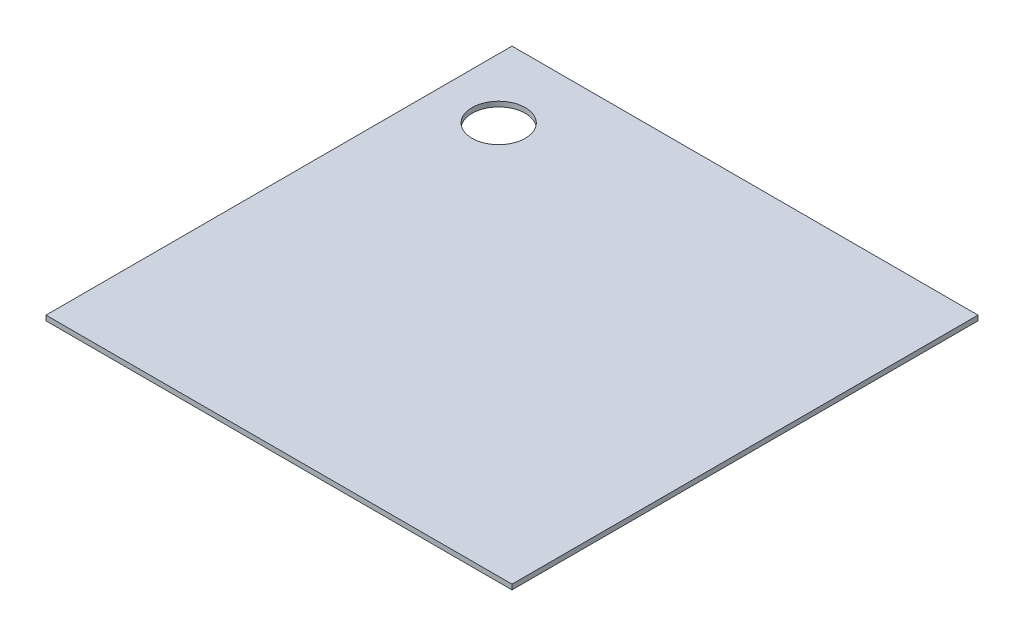
ISO-10303-21;
HEADER;
FILE_DESCRIPTION(('STEP AP214'),'2;1');
FILE_NAME('part.step','',(''),(''),'','','');
FILE_SCHEMA(('AUTOMOTIVE_DESIGN { 1 0 10303 214 1 1 1 1 }'));
ENDSEC;
DATA;
#1=APPLICATION_CONTEXT('core data for automotive mechanical design processes');
#2=APPLICATION_PROTOCOL_DEFINITION('international standard','automotive_design',2000,#1);
#3=PRODUCT_CONTEXT('',#1,'mechanical');
#4=PRODUCT('Part','Part','',(#3));
#5=PRODUCT_RELATED_PRODUCT_CATEGORY('part','',(#4));
#6=PRODUCT_DEFINITION_FORMATION('','',#4);
#7=PRODUCT_DEFINITION_CONTEXT('part definition',#1,'design');
#8=PRODUCT_DEFINITION('design','',#6,#7);
#9=PRODUCT_DEFINITION_SHAPE('','',#8);
#10=(LENGTH_UNIT() NAMED_UNIT(*) SI_UNIT(.MILLI.,.METRE.));
#11=(NAMED_UNIT(*) PLANE_ANGLE_UNIT() SI_UNIT($,.RADIAN.));
#12=(NAMED_UNIT(*) SI_UNIT($,.STERADIAN.) SOLID_ANGLE_UNIT());
#13=UNCERTAINTY_MEASURE_WITH_UNIT(LENGTH_MEASURE(1.E-05),#10,'distance_accuracy_value','');
#14=(GEOMETRIC_REPRESENTATION_CONTEXT(3) GLOBAL_UNCERTAINTY_ASSIGNED_CONTEXT((#13)) GLOBAL_UNIT_ASSIGNED_CONTEXT((#10,
#11,#12)) REPRESENTATION_CONTEXT('',''));
#15=CARTESIAN_POINT('',(0.,0.,0.));
#16=DIRECTION('',(0.,0.,1.));
#17=DIRECTION('',(1.,0.,0.));
#18=AXIS2_PLACEMENT_3D('',#15,#16,#17);
#19=CARTESIAN_POINT('',(0.,1.5,0.));
#20=DIRECTION('',(0.,1.,0.));
#21=DIRECTION('',(0.,0.,1.));
#22=AXIS2_PLACEMENT_3D('',#19,#20,#21);
#23=PLANE('',#22);
#24=DIRECTION('',(0.,0.,1.));
#25=VECTOR('',#24,1.);
#26=CARTESIAN_POINT('',(-140.,1.5,140.));
#27=LINE('',#26,#25);
#28=CARTESIAN_POINT('',(-140.,1.5,-140.));
#29=VERTEX_POINT('',#28);
#30=CARTESIAN_POINT('',(-140.,1.5,140.));
#31=VERTEX_POINT('',#30);
#32=EDGE_CURVE('E99',#29,#31,#27,.T.);
#33=ORIENTED_EDGE('',*,*,#32,.T.);
#34=DIRECTION('',(1.,0.,0.));
#35=VECTOR('',#34,1.);
#36=CARTESIAN_POINT('',(140.,1.5,140.));
#37=LINE('',#36,#35);
#38=CARTESIAN_POINT('',(140.,1.5,140.));
#39=VERTEX_POINT('',#38);
#40=EDGE_CURVE('E94',#31,#39,#37,.T.);
#41=ORIENTED_EDGE('',*,*,#40,.T.);
#42=DIRECTION('',(0.,0.,-1.));
#43=VECTOR('',#42,1.);
#44=CARTESIAN_POINT('',(140.,1.5,140.));
#45=LINE('',#44,#43);
#46=CARTESIAN_POINT('',(140.,1.5,-140.));
#47=VERTEX_POINT('',#46);
#48=EDGE_CURVE('E97',#39,#47,#45,.T.);
#49=ORIENTED_EDGE('',*,*,#48,.T.);
#50=DIRECTION('',(-1.,0.,0.));
#51=VECTOR('',#50,1.);
#52=CARTESIAN_POINT('',(140.,1.5,-140.));
#53=LINE('',#52,#51);
#54=EDGE_CURVE('E64',#47,#29,#53,.T.);
#55=ORIENTED_EDGE('',*,*,#54,.T.);
#56=EDGE_LOOP('',(#33,#41,#49,#55));
#57=FACE_BOUND('',#56,.T.);
#58=CARTESIAN_POINT('',(-104.,1.5,-96.));
#59=DIRECTION('',(0.,1.,0.));
#60=DIRECTION('',(0.,0.,1.));
#61=AXIS2_PLACEMENT_3D('',#58,#59,#60);
#62=CIRCLE('',#61,16.);
#63=CARTESIAN_POINT('',(-104.,1.5,-80.));
#64=VERTEX_POINT('',#63);
#65=EDGE_CURVE('E114',#64,#64,#62,.T.);
#66=ORIENTED_EDGE('',*,*,#65,.F.);
#67=EDGE_LOOP('',(#66));
#68=FACE_BOUND('',#67,.T.);
#69=ADVANCED_FACE('F47',(#57,#68),#23,.T.);
#70=CARTESIAN_POINT('',(0.,-1.5,0.));
#71=DIRECTION('',(0.,1.,0.));
#72=DIRECTION('',(0.,0.,1.));
#73=AXIS2_PLACEMENT_3D('',#70,#71,#72);
#74=PLANE('',#73);
#75=DIRECTION('',(0.,0.,1.));
#76=VECTOR('',#75,1.);
#77=CARTESIAN_POINT('',(-140.,-1.5,140.));
#78=LINE('',#77,#76);
#79=CARTESIAN_POINT('',(-140.,-1.5,-140.));
#80=VERTEX_POINT('',#79);
#81=CARTESIAN_POINT('',(-140.,-1.5,140.));
#82=VERTEX_POINT('',#81);
#83=EDGE_CURVE('E111',#80,#82,#78,.T.);
#84=ORIENTED_EDGE('',*,*,#83,.F.);
#85=DIRECTION('',(-1.,0.,0.));
#86=VECTOR('',#85,1.);
#87=CARTESIAN_POINT('',(140.,-1.5,-140.));
#88=LINE('',#87,#86);
#89=CARTESIAN_POINT('',(140.,-1.5,-140.));
#90=VERTEX_POINT('',#89);
#91=EDGE_CURVE('E87',#90,#80,#88,.T.);
#92=ORIENTED_EDGE('',*,*,#91,.F.);
#93=DIRECTION('',(0.,0.,-1.));
#94=VECTOR('',#93,1.);
#95=CARTESIAN_POINT('',(140.,-1.5,140.));
#96=LINE('',#95,#94);
#97=CARTESIAN_POINT('',(140.,-1.5,140.));
#98=VERTEX_POINT('',#97);
#99=EDGE_CURVE('E81',#98,#90,#96,.T.);
#100=ORIENTED_EDGE('',*,*,#99,.F.);
#101=DIRECTION('',(1.,0.,0.));
#102=VECTOR('',#101,1.);
#103=CARTESIAN_POINT('',(140.,-1.5,140.));
#104=LINE('',#103,#102);
#105=EDGE_CURVE('E103',#82,#98,#104,.T.);
#106=ORIENTED_EDGE('',*,*,#105,.F.);
#107=EDGE_LOOP('',(#84,#92,#100,#106));
#108=FACE_BOUND('',#107,.T.);
#109=CARTESIAN_POINT('',(-104.,-1.5,-96.));
#110=DIRECTION('',(0.,1.,0.));
#111=DIRECTION('',(0.,0.,1.));
#112=AXIS2_PLACEMENT_3D('',#109,#110,#111);
#113=CIRCLE('',#112,16.);
#114=CARTESIAN_POINT('',(-104.,-1.5,-80.));
#115=VERTEX_POINT('',#114);
#116=EDGE_CURVE('E126',#115,#115,#113,.T.);
#117=ORIENTED_EDGE('',*,*,#116,.T.);
#118=EDGE_LOOP('',(#117));
#119=FACE_BOUND('',#118,.T.);
#120=ADVANCED_FACE('F122',(#108,#119),#74,.F.);
#121=CARTESIAN_POINT('',(-140.,1.5,140.));
#122=DIRECTION('',(1.,0.,0.));
#123=DIRECTION('',(0.,0.,-1.));
#124=AXIS2_PLACEMENT_3D('',#121,#122,#123);
#125=PLANE('',#124);
#126=ORIENTED_EDGE('',*,*,#83,.T.);
#127=DIRECTION('',(0.,-1.,0.));
#128=VECTOR('',#127,1.);
#129=CARTESIAN_POINT('',(-140.,1.5,140.));
#130=LINE('',#129,#128);
#131=EDGE_CURVE('E11',#31,#82,#130,.T.);
#132=ORIENTED_EDGE('',*,*,#131,.F.);
#133=ORIENTED_EDGE('',*,*,#32,.F.);
#134=DIRECTION('',(0.,-1.,0.));
#135=VECTOR('',#134,1.);
#136=CARTESIAN_POINT('',(-140.,1.5,-140.));
#137=LINE('',#136,#135);
#138=EDGE_CURVE('E107',#29,#80,#137,.T.);
#139=ORIENTED_EDGE('',*,*,#138,.T.);
#140=EDGE_LOOP('',(#126,#132,#133,#139));
#141=FACE_BOUND('',#140,.T.);
#142=ADVANCED_FACE('F49',(#141),#125,.F.);
#143=CARTESIAN_POINT('',(140.,1.5,140.));
#144=DIRECTION('',(0.,0.,-1.));
#145=DIRECTION('',(-1.,0.,0.));
#146=AXIS2_PLACEMENT_3D('',#143,#144,#145);
#147=PLANE('',#146);
#148=ORIENTED_EDGE('',*,*,#105,.T.);
#149=DIRECTION('',(0.,-1.,0.));
#150=VECTOR('',#149,1.);
#151=CARTESIAN_POINT('',(140.,1.5,140.));
#152=LINE('',#151,#150);
#153=EDGE_CURVE('E56',#39,#98,#152,.T.);
#154=ORIENTED_EDGE('',*,*,#153,.F.);
#155=ORIENTED_EDGE('',*,*,#40,.F.);
#156=ORIENTED_EDGE('',*,*,#131,.T.);
#157=EDGE_LOOP('',(#148,#154,#155,#156));
#158=FACE_BOUND('',#157,.T.);
#159=ADVANCED_FACE('F102',(#158),#147,.F.);
#160=CARTESIAN_POINT('',(140.,1.5,140.));
#161=DIRECTION('',(-1.,0.,0.));
#162=DIRECTION('',(0.,0.,1.));
#163=AXIS2_PLACEMENT_3D('',#160,#161,#162);
#164=PLANE('',#163);
#165=ORIENTED_EDGE('',*,*,#99,.T.);
#166=DIRECTION('',(0.,-1.,0.));
#167=VECTOR('',#166,1.);
#168=CARTESIAN_POINT('',(140.,1.5,-140.));
#169=LINE('',#168,#167);
#170=EDGE_CURVE('E104',#47,#90,#169,.T.);
#171=ORIENTED_EDGE('',*,*,#170,.F.);
#172=ORIENTED_EDGE('',*,*,#48,.F.);
#173=ORIENTED_EDGE('',*,*,#153,.T.);
#174=EDGE_LOOP('',(#165,#171,#172,#173));
#175=FACE_BOUND('',#174,.T.);
#176=ADVANCED_FACE('F105',(#175),#164,.F.);
#177=CARTESIAN_POINT('',(140.,1.5,-140.));
#178=DIRECTION('',(0.,0.,1.));
#179=DIRECTION('',(1.,0.,0.));
#180=AXIS2_PLACEMENT_3D('',#177,#178,#179);
#181=PLANE('',#180);
#182=ORIENTED_EDGE('',*,*,#91,.T.);
#183=ORIENTED_EDGE('',*,*,#138,.F.);
#184=ORIENTED_EDGE('',*,*,#54,.F.);
#185=ORIENTED_EDGE('',*,*,#170,.T.);
#186=EDGE_LOOP('',(#182,#183,#184,#185));
#187=FACE_BOUND('',#186,.T.);
#188=ADVANCED_FACE('F119',(#187),#181,.F.);
#189=CARTESIAN_POINT('',(-104.,1.5,-96.));
#190=DIRECTION('',(0.,-1.,0.));
#191=DIRECTION('',(0.,0.,-1.));
#192=AXIS2_PLACEMENT_3D('',#189,#190,#191);
#193=CYLINDRICAL_SURFACE('',#192,16.);
#194=ORIENTED_EDGE('',*,*,#65,.T.);
#195=EDGE_LOOP('',(#194));
#196=FACE_BOUND('',#195,.T.);
#197=ORIENTED_EDGE('',*,*,#116,.F.);
#198=EDGE_LOOP('',(#197));
#199=FACE_BOUND('',#198,.T.);
#200=ADVANCED_FACE('F132',(#196,#199),#193,.F.);
#201=CLOSED_SHELL('',(#69,#120,#142,#159,#176,#188,#200));
#202=MANIFOLD_SOLID_BREP('B2',#201);
#203=ADVANCED_BREP_SHAPE_REPRESENTATION('',(#18,#202),#14);
#204=SHAPE_DEFINITION_REPRESENTATION(#9,#203);
ENDSEC;
END-ISO-10303-21;
